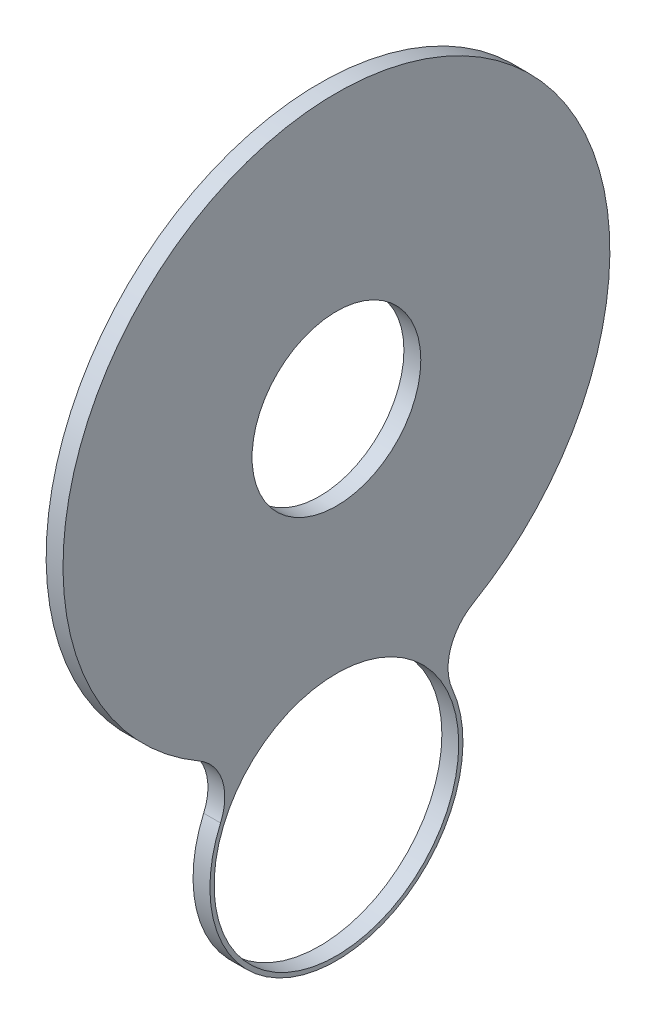
ISO-10303-21;
HEADER;
FILE_DESCRIPTION(('STEP AP214'),'2;1');
FILE_NAME('part.step','',(''),(''),'','','');
FILE_SCHEMA(('AUTOMOTIVE_DESIGN { 1 0 10303 214 1 1 1 1 }'));
ENDSEC;
DATA;
#1=APPLICATION_CONTEXT('core data for automotive mechanical design processes');
#2=APPLICATION_PROTOCOL_DEFINITION('international standard','automotive_design',2000,#1);
#3=PRODUCT_CONTEXT('',#1,'mechanical');
#4=PRODUCT('Part','Part','',(#3));
#5=PRODUCT_RELATED_PRODUCT_CATEGORY('part','',(#4));
#6=PRODUCT_DEFINITION_FORMATION('','',#4);
#7=PRODUCT_DEFINITION_CONTEXT('part definition',#1,'design');
#8=PRODUCT_DEFINITION('design','',#6,#7);
#9=PRODUCT_DEFINITION_SHAPE('','',#8);
#10=(LENGTH_UNIT() NAMED_UNIT(*) SI_UNIT(.MILLI.,.METRE.));
#11=(NAMED_UNIT(*) PLANE_ANGLE_UNIT() SI_UNIT($,.RADIAN.));
#12=(NAMED_UNIT(*) SI_UNIT($,.STERADIAN.) SOLID_ANGLE_UNIT());
#13=UNCERTAINTY_MEASURE_WITH_UNIT(LENGTH_MEASURE(1.E-05),#10,'distance_accuracy_value','');
#14=(GEOMETRIC_REPRESENTATION_CONTEXT(3) GLOBAL_UNCERTAINTY_ASSIGNED_CONTEXT((#13)) GLOBAL_UNIT_ASSIGNED_CONTEXT((#10,
#11,#12)) REPRESENTATION_CONTEXT('',''));
#15=CARTESIAN_POINT('',(0.,0.,0.));
#16=DIRECTION('',(0.,0.,1.));
#17=DIRECTION('',(1.,0.,0.));
#18=AXIS2_PLACEMENT_3D('',#15,#16,#17);
#19=CARTESIAN_POINT('',(10.,66.5725562799827,-48.0874272907147));
#20=DIRECTION('',(-1.,0.,0.));
#21=DIRECTION('',(0.,0.,1.));
#22=AXIS2_PLACEMENT_3D('',#19,#20,#21);
#23=PLANE('',#22);
#24=CARTESIAN_POINT('',(10.,-58.6916642871729,0.));
#25=DIRECTION('',(1.,0.,0.));
#26=DIRECTION('',(0.,0.,-1.));
#27=AXIS2_PLACEMENT_3D('',#24,#25,#26);
#28=CIRCLE('',#27,72.5);
#29=CARTESIAN_POINT('',(10.,-58.6916642871729,-72.5));
#30=VERTEX_POINT('',#29);
#31=EDGE_CURVE('E117',#30,#30,#28,.T.);
#32=ORIENTED_EDGE('',*,*,#31,.F.);
#33=EDGE_LOOP('',(#32));
#34=FACE_BOUND('',#33,.T.);
#35=CARTESIAN_POINT('',(10.,-16.5562000528617,-96.1748545814294));
#36=DIRECTION('',(-1.,0.,0.));
#37=DIRECTION('',(0.,0.,1.));
#38=AXIS2_PLACEMENT_3D('',#35,#36,#37);
#39=CIRCLE('',#38,30.);
#40=CARTESIAN_POINT('',(10.,-28.5949041198078,-68.696324701021));
#41=VERTEX_POINT('',#40);
#42=CARTESIAN_POINT('',(10.,9.41197076313097,-81.1530669224513));
#43=VERTEX_POINT('',#42);
#44=EDGE_CURVE('E84',#41,#43,#39,.T.);
#45=ORIENTED_EDGE('',*,*,#44,.T.);
#46=CARTESIAN_POINT('',(10.,149.701312612827,0.));
#47=DIRECTION('',(1.,0.,0.));
#48=DIRECTION('',(0.,0.,-1.));
#49=AXIS2_PLACEMENT_3D('',#46,#47,#48);
#50=CIRCLE('',#49,162.0707244);
#51=CARTESIAN_POINT('',(10.,9.41197076313103,81.1530669224514));
#52=VERTEX_POINT('',#51);
#53=EDGE_CURVE('E79',#43,#52,#50,.T.);
#54=ORIENTED_EDGE('',*,*,#53,.T.);
#55=CARTESIAN_POINT('',(10.,-16.5562000528617,96.1748545814294));
#56=DIRECTION('',(-1.,0.,0.));
#57=DIRECTION('',(0.,0.,-1.));
#58=AXIS2_PLACEMENT_3D('',#55,#56,#57);
#59=CIRCLE('',#58,30.);
#60=CARTESIAN_POINT('',(10.,-28.5949041198078,68.696324701021));
#61=VERTEX_POINT('',#60);
#62=EDGE_CURVE('E82',#52,#61,#59,.T.);
#63=ORIENTED_EDGE('',*,*,#62,.T.);
#64=CARTESIAN_POINT('',(10.,-58.6916642871729,0.));
#65=DIRECTION('',(1.,0.,0.));
#66=DIRECTION('',(0.,0.,-1.));
#67=AXIS2_PLACEMENT_3D('',#64,#65,#66);
#68=CIRCLE('',#67,75.);
#69=EDGE_CURVE('E49',#61,#41,#68,.T.);
#70=ORIENTED_EDGE('',*,*,#69,.T.);
#71=EDGE_LOOP('',(#45,#54,#63,#70));
#72=FACE_BOUND('',#71,.T.);
#73=CARTESIAN_POINT('',(10.,149.701312612827,0.));
#74=DIRECTION('',(1.,0.,0.));
#75=DIRECTION('',(0.,0.,-1.));
#76=AXIS2_PLACEMENT_3D('',#73,#74,#75);
#77=CIRCLE('',#76,50.);
#78=CARTESIAN_POINT('',(10.,149.701312612827,-50.));
#79=VERTEX_POINT('',#78);
#80=EDGE_CURVE('E99',#79,#79,#77,.T.);
#81=ORIENTED_EDGE('',*,*,#80,.F.);
#82=EDGE_LOOP('',(#81));
#83=FACE_BOUND('',#82,.T.);
#84=ADVANCED_FACE('F32',(#34,#72,#83),#23,.F.);
#85=CARTESIAN_POINT('',(0.,66.5725562799827,-48.0874272907147));
#86=DIRECTION('',(-1.,0.,0.));
#87=DIRECTION('',(0.,0.,1.));
#88=AXIS2_PLACEMENT_3D('',#85,#86,#87);
#89=PLANE('',#88);
#90=CARTESIAN_POINT('',(0.,-58.6916642871729,0.));
#91=DIRECTION('',(1.,0.,0.));
#92=DIRECTION('',(0.,0.,-1.));
#93=AXIS2_PLACEMENT_3D('',#90,#91,#92);
#94=CIRCLE('',#93,72.5);
#95=CARTESIAN_POINT('',(0.,-58.6916642871729,-72.5));
#96=VERTEX_POINT('',#95);
#97=EDGE_CURVE('E114',#96,#96,#94,.T.);
#98=ORIENTED_EDGE('',*,*,#97,.T.);
#99=EDGE_LOOP('',(#98));
#100=FACE_BOUND('',#99,.T.);
#101=CARTESIAN_POINT('',(0.,-16.5562000528617,-96.1748545814294));
#102=DIRECTION('',(-1.,0.,0.));
#103=DIRECTION('',(0.,0.,1.));
#104=AXIS2_PLACEMENT_3D('',#101,#102,#103);
#105=CIRCLE('',#104,30.);
#106=CARTESIAN_POINT('',(0.,-28.5949041198078,-68.696324701021));
#107=VERTEX_POINT('',#106);
#108=CARTESIAN_POINT('',(0.,9.41197076313097,-81.1530669224513));
#109=VERTEX_POINT('',#108);
#110=EDGE_CURVE('E96',#107,#109,#105,.T.);
#111=ORIENTED_EDGE('',*,*,#110,.F.);
#112=CARTESIAN_POINT('',(0.,-58.6916642871729,0.));
#113=DIRECTION('',(1.,0.,0.));
#114=DIRECTION('',(0.,0.,-1.));
#115=AXIS2_PLACEMENT_3D('',#112,#113,#114);
#116=CIRCLE('',#115,75.);
#117=CARTESIAN_POINT('',(0.,-28.5949041198078,68.696324701021));
#118=VERTEX_POINT('',#117);
#119=EDGE_CURVE('E72',#118,#107,#116,.T.);
#120=ORIENTED_EDGE('',*,*,#119,.F.);
#121=CARTESIAN_POINT('',(0.,-16.5562000528617,96.1748545814294));
#122=DIRECTION('',(-1.,0.,0.));
#123=DIRECTION('',(0.,0.,-1.));
#124=AXIS2_PLACEMENT_3D('',#121,#122,#123);
#125=CIRCLE('',#124,30.);
#126=CARTESIAN_POINT('',(0.,9.41197076313103,81.1530669224514));
#127=VERTEX_POINT('',#126);
#128=EDGE_CURVE('E66',#127,#118,#125,.T.);
#129=ORIENTED_EDGE('',*,*,#128,.F.);
#130=CARTESIAN_POINT('',(0.,149.701312612827,0.));
#131=DIRECTION('',(1.,0.,0.));
#132=DIRECTION('',(0.,0.,-1.));
#133=AXIS2_PLACEMENT_3D('',#130,#131,#132);
#134=CIRCLE('',#133,162.0707244);
#135=EDGE_CURVE('E88',#109,#127,#134,.T.);
#136=ORIENTED_EDGE('',*,*,#135,.F.);
#137=EDGE_LOOP('',(#111,#120,#129,#136));
#138=FACE_BOUND('',#137,.T.);
#139=CARTESIAN_POINT('',(0.,149.701312612827,0.));
#140=DIRECTION('',(1.,0.,0.));
#141=DIRECTION('',(0.,0.,-1.));
#142=AXIS2_PLACEMENT_3D('',#139,#140,#141);
#143=CIRCLE('',#142,50.);
#144=CARTESIAN_POINT('',(0.,149.701312612827,-50.));
#145=VERTEX_POINT('',#144);
#146=EDGE_CURVE('E111',#145,#145,#143,.T.);
#147=ORIENTED_EDGE('',*,*,#146,.T.);
#148=EDGE_LOOP('',(#147));
#149=FACE_BOUND('',#148,.T.);
#150=ADVANCED_FACE('F107',(#100,#138,#149),#89,.T.);
#151=CARTESIAN_POINT('',(10.,-16.5562000528617,-96.1748545814294));
#152=DIRECTION('',(-1.,0.,0.));
#153=DIRECTION('',(0.,0.,1.));
#154=AXIS2_PLACEMENT_3D('',#151,#152,#153);
#155=CYLINDRICAL_SURFACE('',#154,30.);
#156=ORIENTED_EDGE('',*,*,#110,.T.);
#157=DIRECTION('',(-1.,0.,0.));
#158=VECTOR('',#157,1.);
#159=CARTESIAN_POINT('',(10.,9.41197076313097,-81.1530669224513));
#160=LINE('',#159,#158);
#161=EDGE_CURVE('E11',#43,#109,#160,.T.);
#162=ORIENTED_EDGE('',*,*,#161,.F.);
#163=ORIENTED_EDGE('',*,*,#44,.F.);
#164=DIRECTION('',(-1.,0.,0.));
#165=VECTOR('',#164,1.);
#166=CARTESIAN_POINT('',(10.,-28.5949041198078,-68.696324701021));
#167=LINE('',#166,#165);
#168=EDGE_CURVE('E92',#41,#107,#167,.T.);
#169=ORIENTED_EDGE('',*,*,#168,.T.);
#170=EDGE_LOOP('',(#156,#162,#163,#169));
#171=FACE_BOUND('',#170,.T.);
#172=ADVANCED_FACE('F34',(#171),#155,.F.);
#173=CARTESIAN_POINT('',(10.,149.701312612827,0.));
#174=DIRECTION('',(-1.,0.,0.));
#175=DIRECTION('',(0.,0.,1.));
#176=AXIS2_PLACEMENT_3D('',#173,#174,#175);
#177=CYLINDRICAL_SURFACE('',#176,162.0707244);
#178=ORIENTED_EDGE('',*,*,#135,.T.);
#179=DIRECTION('',(-1.,0.,0.));
#180=VECTOR('',#179,1.);
#181=CARTESIAN_POINT('',(10.,9.41197076313103,81.1530669224514));
#182=LINE('',#181,#180);
#183=EDGE_CURVE('E41',#52,#127,#182,.T.);
#184=ORIENTED_EDGE('',*,*,#183,.F.);
#185=ORIENTED_EDGE('',*,*,#53,.F.);
#186=ORIENTED_EDGE('',*,*,#161,.T.);
#187=EDGE_LOOP('',(#178,#184,#185,#186));
#188=FACE_BOUND('',#187,.T.);
#189=ADVANCED_FACE('F87',(#188),#177,.T.);
#190=CARTESIAN_POINT('',(10.,-16.5562000528617,96.1748545814294));
#191=DIRECTION('',(-1.,0.,0.));
#192=DIRECTION('',(0.,0.,1.));
#193=AXIS2_PLACEMENT_3D('',#190,#191,#192);
#194=CYLINDRICAL_SURFACE('',#193,30.);
#195=ORIENTED_EDGE('',*,*,#128,.T.);
#196=DIRECTION('',(-1.,0.,0.));
#197=VECTOR('',#196,1.);
#198=CARTESIAN_POINT('',(10.,-28.5949041198078,68.696324701021));
#199=LINE('',#198,#197);
#200=EDGE_CURVE('E89',#61,#118,#199,.T.);
#201=ORIENTED_EDGE('',*,*,#200,.F.);
#202=ORIENTED_EDGE('',*,*,#62,.F.);
#203=ORIENTED_EDGE('',*,*,#183,.T.);
#204=EDGE_LOOP('',(#195,#201,#202,#203));
#205=FACE_BOUND('',#204,.T.);
#206=ADVANCED_FACE('F90',(#205),#194,.F.);
#207=CARTESIAN_POINT('',(10.,-58.6916642871729,0.));
#208=DIRECTION('',(-1.,0.,0.));
#209=DIRECTION('',(0.,0.,1.));
#210=AXIS2_PLACEMENT_3D('',#207,#208,#209);
#211=CYLINDRICAL_SURFACE('',#210,75.);
#212=ORIENTED_EDGE('',*,*,#119,.T.);
#213=ORIENTED_EDGE('',*,*,#168,.F.);
#214=ORIENTED_EDGE('',*,*,#69,.F.);
#215=ORIENTED_EDGE('',*,*,#200,.T.);
#216=EDGE_LOOP('',(#212,#213,#214,#215));
#217=FACE_BOUND('',#216,.T.);
#218=ADVANCED_FACE('F104',(#217),#211,.T.);
#219=CARTESIAN_POINT('',(10.,149.701312612827,0.));
#220=DIRECTION('',(-1.,0.,0.));
#221=DIRECTION('',(0.,0.,1.));
#222=AXIS2_PLACEMENT_3D('',#219,#220,#221);
#223=CYLINDRICAL_SURFACE('',#222,50.);
#224=ORIENTED_EDGE('',*,*,#80,.T.);
#225=EDGE_LOOP('',(#224));
#226=FACE_BOUND('',#225,.T.);
#227=ORIENTED_EDGE('',*,*,#146,.F.);
#228=EDGE_LOOP('',(#227));
#229=FACE_BOUND('',#228,.T.);
#230=ADVANCED_FACE('F127',(#226,#229),#223,.F.);
#231=CARTESIAN_POINT('',(0.,-58.6916642871729,0.));
#232=DIRECTION('',(1.,0.,0.));
#233=DIRECTION('',(0.,0.,-1.));
#234=AXIS2_PLACEMENT_3D('',#231,#232,#233);
#235=CYLINDRICAL_SURFACE('',#234,72.5);
#236=ORIENTED_EDGE('',*,*,#97,.F.);
#237=EDGE_LOOP('',(#236));
#238=FACE_BOUND('',#237,.T.);
#239=ORIENTED_EDGE('',*,*,#31,.T.);
#240=EDGE_LOOP('',(#239));
#241=FACE_BOUND('',#240,.T.);
#242=ADVANCED_FACE('F124',(#238,#241),#235,.F.);
#243=CLOSED_SHELL('',(#84,#150,#172,#189,#206,#218,#230,#242));
#244=MANIFOLD_SOLID_BREP('B2',#243);
#245=ADVANCED_BREP_SHAPE_REPRESENTATION('',(#18,#244),#14);
#246=SHAPE_DEFINITION_REPRESENTATION(#9,#245);
ENDSEC;
END-ISO-10303-21;
